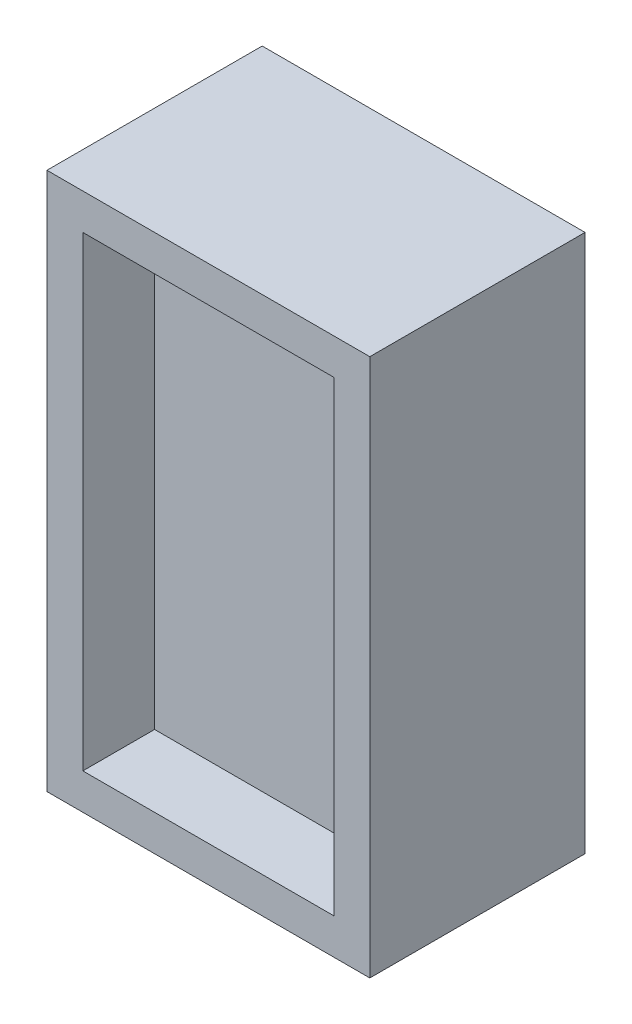
ISO-10303-21;
HEADER;
FILE_DESCRIPTION(('STEP AP214'),'2;1');
FILE_NAME('part.step','',(''),(''),'','','');
FILE_SCHEMA(('AUTOMOTIVE_DESIGN { 1 0 10303 214 1 1 1 1 }'));
ENDSEC;
DATA;
#1=APPLICATION_CONTEXT('core data for automotive mechanical design processes');
#2=APPLICATION_PROTOCOL_DEFINITION('international standard','automotive_design',2000,#1);
#3=PRODUCT_CONTEXT('',#1,'mechanical');
#4=PRODUCT('Part','Part','',(#3));
#5=PRODUCT_RELATED_PRODUCT_CATEGORY('part','',(#4));
#6=PRODUCT_DEFINITION_FORMATION('','',#4);
#7=PRODUCT_DEFINITION_CONTEXT('part definition',#1,'design');
#8=PRODUCT_DEFINITION('design','',#6,#7);
#9=PRODUCT_DEFINITION_SHAPE('','',#8);
#10=(LENGTH_UNIT() NAMED_UNIT(*) SI_UNIT(.MILLI.,.METRE.));
#11=(NAMED_UNIT(*) PLANE_ANGLE_UNIT() SI_UNIT($,.RADIAN.));
#12=(NAMED_UNIT(*) SI_UNIT($,.STERADIAN.) SOLID_ANGLE_UNIT());
#13=UNCERTAINTY_MEASURE_WITH_UNIT(LENGTH_MEASURE(1.E-05),#10,'distance_accuracy_value','');
#14=(GEOMETRIC_REPRESENTATION_CONTEXT(3) GLOBAL_UNCERTAINTY_ASSIGNED_CONTEXT((#13)) GLOBAL_UNIT_ASSIGNED_CONTEXT((#10,
#11,#12)) REPRESENTATION_CONTEXT('',''));
#15=CARTESIAN_POINT('',(0.,0.,0.));
#16=DIRECTION('',(0.,0.,1.));
#17=DIRECTION('',(1.,0.,0.));
#18=AXIS2_PLACEMENT_3D('',#15,#16,#17);
#19=CARTESIAN_POINT('',(0.,0.,38.1));
#20=DIRECTION('',(1.,0.,0.));
#21=DIRECTION('',(0.,1.,0.));
#22=AXIS2_PLACEMENT_3D('',#19,#20,#21);
#23=PLANE('',#22);
#24=DIRECTION('',(0.,-1.,0.));
#25=VECTOR('',#24,1.);
#26=CARTESIAN_POINT('',(0.,0.,0.));
#27=LINE('',#26,#25);
#28=CARTESIAN_POINT('',(0.,0.,0.));
#29=VERTEX_POINT('',#28);
#30=CARTESIAN_POINT('',(0.,-95.25,0.));
#31=VERTEX_POINT('',#30);
#32=EDGE_CURVE('E147',#29,#31,#27,.T.);
#33=ORIENTED_EDGE('',*,*,#32,.T.);
#34=DIRECTION('',(0.,0.,-1.));
#35=VECTOR('',#34,1.);
#36=CARTESIAN_POINT('',(0.,-95.25,38.1));
#37=LINE('',#36,#35);
#38=CARTESIAN_POINT('',(0.,-95.25,38.1));
#39=VERTEX_POINT('',#38);
#40=EDGE_CURVE('E11',#39,#31,#37,.T.);
#41=ORIENTED_EDGE('',*,*,#40,.F.);
#42=DIRECTION('',(0.,-1.,0.));
#43=VECTOR('',#42,1.);
#44=CARTESIAN_POINT('',(0.,0.,38.1));
#45=LINE('',#44,#43);
#46=CARTESIAN_POINT('',(0.,0.,38.1));
#47=VERTEX_POINT('',#46);
#48=EDGE_CURVE('E151',#47,#39,#45,.T.);
#49=ORIENTED_EDGE('',*,*,#48,.F.);
#50=DIRECTION('',(0.,0.,-1.));
#51=VECTOR('',#50,1.);
#52=CARTESIAN_POINT('',(0.,0.,38.1));
#53=LINE('',#52,#51);
#54=EDGE_CURVE('E157',#47,#29,#53,.T.);
#55=ORIENTED_EDGE('',*,*,#54,.T.);
#56=EDGE_LOOP('',(#33,#41,#49,#55));
#57=FACE_BOUND('',#56,.T.);
#58=ADVANCED_FACE('F39',(#57),#23,.F.);
#59=CARTESIAN_POINT('',(0.,-95.25,38.1));
#60=DIRECTION('',(0.,1.,0.));
#61=DIRECTION('',(0.,0.,1.));
#62=AXIS2_PLACEMENT_3D('',#59,#60,#61);
#63=PLANE('',#62);
#64=DIRECTION('',(1.,0.,0.));
#65=VECTOR('',#64,1.);
#66=CARTESIAN_POINT('',(0.,-95.25,0.));
#67=LINE('',#66,#65);
#68=CARTESIAN_POINT('',(57.15,-95.25,0.));
#69=VERTEX_POINT('',#68);
#70=EDGE_CURVE('E160',#31,#69,#67,.T.);
#71=ORIENTED_EDGE('',*,*,#70,.T.);
#72=DIRECTION('',(0.,0.,-1.));
#73=VECTOR('',#72,1.);
#74=CARTESIAN_POINT('',(57.15,-95.25,38.1));
#75=LINE('',#74,#73);
#76=CARTESIAN_POINT('',(57.15,-95.25,38.1));
#77=VERTEX_POINT('',#76);
#78=EDGE_CURVE('E46',#77,#69,#75,.T.);
#79=ORIENTED_EDGE('',*,*,#78,.F.);
#80=DIRECTION('',(1.,0.,0.));
#81=VECTOR('',#80,1.);
#82=CARTESIAN_POINT('',(0.,-95.25,38.1));
#83=LINE('',#82,#81);
#84=EDGE_CURVE('E90',#39,#77,#83,.T.);
#85=ORIENTED_EDGE('',*,*,#84,.F.);
#86=ORIENTED_EDGE('',*,*,#40,.T.);
#87=EDGE_LOOP('',(#71,#79,#85,#86));
#88=FACE_BOUND('',#87,.T.);
#89=ADVANCED_FACE('F190',(#88),#63,.F.);
#90=CARTESIAN_POINT('',(57.15,0.,38.1));
#91=DIRECTION('',(-1.,0.,0.));
#92=DIRECTION('',(0.,-1.,0.));
#93=AXIS2_PLACEMENT_3D('',#90,#91,#92);
#94=PLANE('',#93);
#95=DIRECTION('',(0.,1.,0.));
#96=VECTOR('',#95,1.);
#97=CARTESIAN_POINT('',(57.15,0.,0.));
#98=LINE('',#97,#96);
#99=CARTESIAN_POINT('',(57.15,0.,0.));
#100=VERTEX_POINT('',#99);
#101=EDGE_CURVE('E162',#69,#100,#98,.T.);
#102=ORIENTED_EDGE('',*,*,#101,.T.);
#103=DIRECTION('',(0.,0.,-1.));
#104=VECTOR('',#103,1.);
#105=CARTESIAN_POINT('',(57.15,0.,38.1));
#106=LINE('',#105,#104);
#107=CARTESIAN_POINT('',(57.15,0.,38.1));
#108=VERTEX_POINT('',#107);
#109=EDGE_CURVE('E166',#108,#100,#106,.T.);
#110=ORIENTED_EDGE('',*,*,#109,.F.);
#111=DIRECTION('',(0.,1.,0.));
#112=VECTOR('',#111,1.);
#113=CARTESIAN_POINT('',(57.15,0.,38.1));
#114=LINE('',#113,#112);
#115=EDGE_CURVE('E154',#77,#108,#114,.T.);
#116=ORIENTED_EDGE('',*,*,#115,.F.);
#117=ORIENTED_EDGE('',*,*,#78,.T.);
#118=EDGE_LOOP('',(#102,#110,#116,#117));
#119=FACE_BOUND('',#118,.T.);
#120=ADVANCED_FACE('F171',(#119),#94,.F.);
#121=CARTESIAN_POINT('',(0.,0.,38.1));
#122=DIRECTION('',(0.,-1.,0.));
#123=DIRECTION('',(0.,0.,-1.));
#124=AXIS2_PLACEMENT_3D('',#121,#122,#123);
#125=PLANE('',#124);
#126=DIRECTION('',(-1.,0.,0.));
#127=VECTOR('',#126,1.);
#128=CARTESIAN_POINT('',(0.,0.,0.));
#129=LINE('',#128,#127);
#130=EDGE_CURVE('E83',#100,#29,#129,.T.);
#131=ORIENTED_EDGE('',*,*,#130,.T.);
#132=ORIENTED_EDGE('',*,*,#54,.F.);
#133=DIRECTION('',(-1.,0.,0.));
#134=VECTOR('',#133,1.);
#135=CARTESIAN_POINT('',(0.,0.,38.1));
#136=LINE('',#135,#134);
#137=EDGE_CURVE('E62',#108,#47,#136,.T.);
#138=ORIENTED_EDGE('',*,*,#137,.F.);
#139=ORIENTED_EDGE('',*,*,#109,.T.);
#140=EDGE_LOOP('',(#131,#132,#138,#139));
#141=FACE_BOUND('',#140,.T.);
#142=ADVANCED_FACE('F179',(#141),#125,.F.);
#143=CARTESIAN_POINT('',(0.,0.,38.1));
#144=DIRECTION('',(0.,0.,1.));
#145=DIRECTION('',(1.,0.,0.));
#146=AXIS2_PLACEMENT_3D('',#143,#144,#145);
#147=PLANE('',#146);
#148=DIRECTION('',(0.,-1.,0.));
#149=VECTOR('',#148,1.);
#150=CARTESIAN_POINT('',(6.35,-6.35,38.1));
#151=LINE('',#150,#149);
#152=CARTESIAN_POINT('',(6.35,-6.35,38.1));
#153=VERTEX_POINT('',#152);
#154=CARTESIAN_POINT('',(6.35000000000001,-88.9,38.1));
#155=VERTEX_POINT('',#154);
#156=EDGE_CURVE('E53',#153,#155,#151,.T.);
#157=ORIENTED_EDGE('',*,*,#156,.F.);
#158=DIRECTION('',(-1.,0.,0.));
#159=VECTOR('',#158,1.);
#160=CARTESIAN_POINT('',(6.35,-6.35,38.1));
#161=LINE('',#160,#159);
#162=CARTESIAN_POINT('',(50.8,-6.35,38.1));
#163=VERTEX_POINT('',#162);
#164=EDGE_CURVE('E132',#163,#153,#161,.T.);
#165=ORIENTED_EDGE('',*,*,#164,.F.);
#166=DIRECTION('',(0.,1.,0.));
#167=VECTOR('',#166,1.);
#168=CARTESIAN_POINT('',(50.8,-6.35,38.1));
#169=LINE('',#168,#167);
#170=CARTESIAN_POINT('',(50.8,-88.9,38.1));
#171=VERTEX_POINT('',#170);
#172=EDGE_CURVE('E135',#171,#163,#169,.T.);
#173=ORIENTED_EDGE('',*,*,#172,.F.);
#174=DIRECTION('',(1.,0.,0.));
#175=VECTOR('',#174,1.);
#176=CARTESIAN_POINT('',(6.35000000000001,-88.9,38.1));
#177=LINE('',#176,#175);
#178=EDGE_CURVE('E141',#155,#171,#177,.T.);
#179=ORIENTED_EDGE('',*,*,#178,.F.);
#180=EDGE_LOOP('',(#157,#165,#173,#179));
#181=FACE_BOUND('',#180,.T.);
#182=ORIENTED_EDGE('',*,*,#48,.T.);
#183=ORIENTED_EDGE('',*,*,#84,.T.);
#184=ORIENTED_EDGE('',*,*,#115,.T.);
#185=ORIENTED_EDGE('',*,*,#137,.T.);
#186=EDGE_LOOP('',(#182,#183,#184,#185));
#187=FACE_BOUND('',#186,.T.);
#188=ADVANCED_FACE('F181',(#181,#187),#147,.T.);
#189=CARTESIAN_POINT('',(0.,0.,0.));
#190=DIRECTION('',(0.,0.,1.));
#191=DIRECTION('',(1.,0.,0.));
#192=AXIS2_PLACEMENT_3D('',#189,#190,#191);
#193=PLANE('',#192);
#194=ORIENTED_EDGE('',*,*,#32,.F.);
#195=ORIENTED_EDGE('',*,*,#130,.F.);
#196=ORIENTED_EDGE('',*,*,#101,.F.);
#197=ORIENTED_EDGE('',*,*,#70,.F.);
#198=EDGE_LOOP('',(#194,#195,#196,#197));
#199=FACE_BOUND('',#198,.T.);
#200=ADVANCED_FACE('F175',(#199),#193,.F.);
#201=CARTESIAN_POINT('',(6.35,-6.35,25.4));
#202=DIRECTION('',(-1.,0.,0.));
#203=DIRECTION('',(0.,-1.,0.));
#204=AXIS2_PLACEMENT_3D('',#201,#202,#203);
#205=PLANE('',#204);
#206=ORIENTED_EDGE('',*,*,#156,.T.);
#207=DIRECTION('',(0.,0.,1.));
#208=VECTOR('',#207,1.);
#209=CARTESIAN_POINT('',(6.35000000000001,-88.9,25.4));
#210=LINE('',#209,#208);
#211=CARTESIAN_POINT('',(6.35000000000001,-88.9,25.4));
#212=VERTEX_POINT('',#211);
#213=EDGE_CURVE('E110',#212,#155,#210,.T.);
#214=ORIENTED_EDGE('',*,*,#213,.F.);
#215=DIRECTION('',(0.,-1.,0.));
#216=VECTOR('',#215,1.);
#217=CARTESIAN_POINT('',(6.35,-6.35,25.4));
#218=LINE('',#217,#216);
#219=CARTESIAN_POINT('',(6.35,-6.35,25.4));
#220=VERTEX_POINT('',#219);
#221=EDGE_CURVE('E114',#220,#212,#218,.T.);
#222=ORIENTED_EDGE('',*,*,#221,.F.);
#223=DIRECTION('',(0.,0.,1.));
#224=VECTOR('',#223,1.);
#225=CARTESIAN_POINT('',(6.35,-6.35,25.4));
#226=LINE('',#225,#224);
#227=EDGE_CURVE('E145',#220,#153,#226,.T.);
#228=ORIENTED_EDGE('',*,*,#227,.T.);
#229=EDGE_LOOP('',(#206,#214,#222,#228));
#230=FACE_BOUND('',#229,.T.);
#231=ADVANCED_FACE('F112',(#230),#205,.F.);
#232=CARTESIAN_POINT('',(6.35,-6.35,25.4));
#233=DIRECTION('',(0.,1.,0.));
#234=DIRECTION('',(0.,0.,1.));
#235=AXIS2_PLACEMENT_3D('',#232,#233,#234);
#236=PLANE('',#235);
#237=ORIENTED_EDGE('',*,*,#164,.T.);
#238=ORIENTED_EDGE('',*,*,#227,.F.);
#239=DIRECTION('',(-1.,0.,0.));
#240=VECTOR('',#239,1.);
#241=CARTESIAN_POINT('',(6.35,-6.35,25.4));
#242=LINE('',#241,#240);
#243=CARTESIAN_POINT('',(50.8,-6.35,25.4));
#244=VERTEX_POINT('',#243);
#245=EDGE_CURVE('E120',#244,#220,#242,.T.);
#246=ORIENTED_EDGE('',*,*,#245,.F.);
#247=DIRECTION('',(0.,0.,1.));
#248=VECTOR('',#247,1.);
#249=CARTESIAN_POINT('',(50.8,-6.35,25.4));
#250=LINE('',#249,#248);
#251=EDGE_CURVE('E148',#244,#163,#250,.T.);
#252=ORIENTED_EDGE('',*,*,#251,.T.);
#253=EDGE_LOOP('',(#237,#238,#246,#252));
#254=FACE_BOUND('',#253,.T.);
#255=ADVANCED_FACE('F230',(#254),#236,.F.);
#256=CARTESIAN_POINT('',(50.8,-6.35,25.4));
#257=DIRECTION('',(1.,0.,0.));
#258=DIRECTION('',(0.,1.,0.));
#259=AXIS2_PLACEMENT_3D('',#256,#257,#258);
#260=PLANE('',#259);
#261=ORIENTED_EDGE('',*,*,#172,.T.);
#262=ORIENTED_EDGE('',*,*,#251,.F.);
#263=DIRECTION('',(0.,1.,0.));
#264=VECTOR('',#263,1.);
#265=CARTESIAN_POINT('',(50.8,-6.35,25.4));
#266=LINE('',#265,#264);
#267=CARTESIAN_POINT('',(50.8,-88.9,25.4));
#268=VERTEX_POINT('',#267);
#269=EDGE_CURVE('E128',#268,#244,#266,.T.);
#270=ORIENTED_EDGE('',*,*,#269,.F.);
#271=DIRECTION('',(0.,0.,1.));
#272=VECTOR('',#271,1.);
#273=CARTESIAN_POINT('',(50.8,-88.9,25.4));
#274=LINE('',#273,#272);
#275=EDGE_CURVE('E119',#268,#171,#274,.T.);
#276=ORIENTED_EDGE('',*,*,#275,.T.);
#277=EDGE_LOOP('',(#261,#262,#270,#276));
#278=FACE_BOUND('',#277,.T.);
#279=ADVANCED_FACE('F239',(#278),#260,.F.);
#280=CARTESIAN_POINT('',(6.35000000000001,-88.9,25.4));
#281=DIRECTION('',(0.,-1.,0.));
#282=DIRECTION('',(0.,0.,-1.));
#283=AXIS2_PLACEMENT_3D('',#280,#281,#282);
#284=PLANE('',#283);
#285=ORIENTED_EDGE('',*,*,#178,.T.);
#286=ORIENTED_EDGE('',*,*,#275,.F.);
#287=DIRECTION('',(1.,0.,0.));
#288=VECTOR('',#287,1.);
#289=CARTESIAN_POINT('',(6.35000000000001,-88.9,25.4));
#290=LINE('',#289,#288);
#291=EDGE_CURVE('E123',#212,#268,#290,.T.);
#292=ORIENTED_EDGE('',*,*,#291,.F.);
#293=ORIENTED_EDGE('',*,*,#213,.T.);
#294=EDGE_LOOP('',(#285,#286,#292,#293));
#295=FACE_BOUND('',#294,.T.);
#296=ADVANCED_FACE('F124',(#295),#284,.F.);
#297=CARTESIAN_POINT('',(0.,0.,25.4));
#298=DIRECTION('',(0.,0.,1.));
#299=DIRECTION('',(1.,0.,0.));
#300=AXIS2_PLACEMENT_3D('',#297,#298,#299);
#301=PLANE('',#300);
#302=ORIENTED_EDGE('',*,*,#221,.T.);
#303=ORIENTED_EDGE('',*,*,#291,.T.);
#304=ORIENTED_EDGE('',*,*,#269,.T.);
#305=ORIENTED_EDGE('',*,*,#245,.T.);
#306=EDGE_LOOP('',(#302,#303,#304,#305));
#307=FACE_BOUND('',#306,.T.);
#308=ADVANCED_FACE('F130',(#307),#301,.T.);
#309=CLOSED_SHELL('',(#58,#89,#120,#142,#188,#200,#231,#255,#279,#296,#308));
#310=MANIFOLD_SOLID_BREP('B2',#309);
#311=ADVANCED_BREP_SHAPE_REPRESENTATION('',(#18,#310),#14);
#312=SHAPE_DEFINITION_REPRESENTATION(#9,#311);
ENDSEC;
END-ISO-10303-21;
